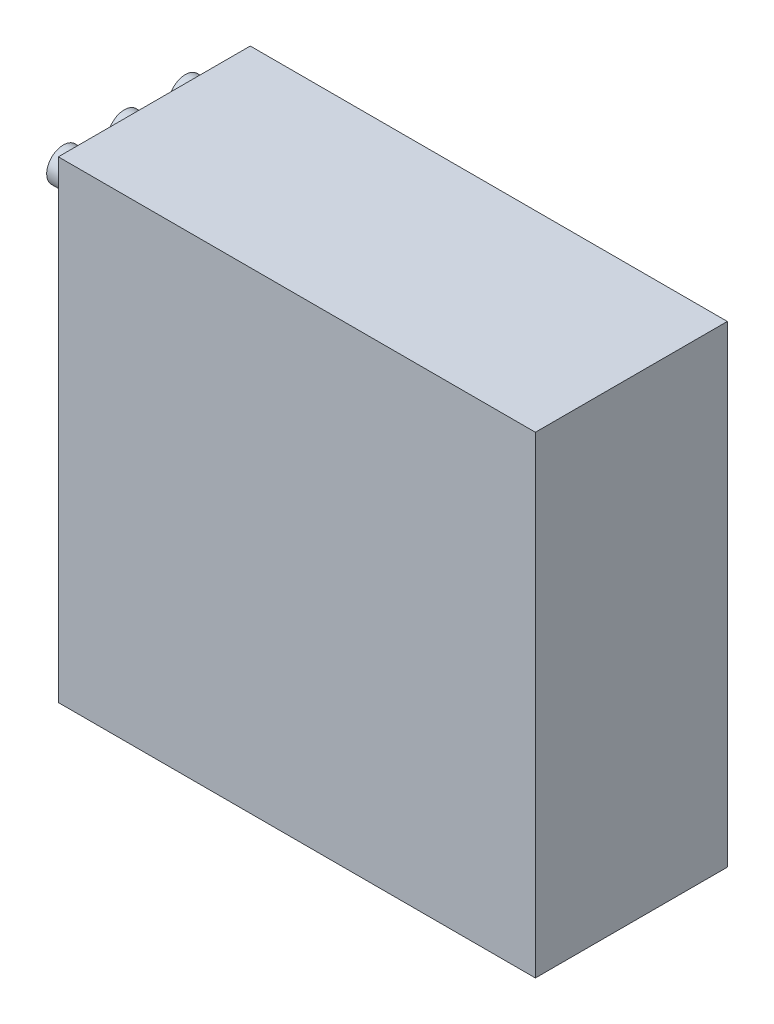
ISO-10303-21;
HEADER;
FILE_DESCRIPTION(('STEP AP214'),'2;1');
FILE_NAME('part.step','',(''),(''),'','','');
FILE_SCHEMA(('AUTOMOTIVE_DESIGN { 1 0 10303 214 1 1 1 1 }'));
ENDSEC;
DATA;
#1=APPLICATION_CONTEXT('core data for automotive mechanical design processes');
#2=APPLICATION_PROTOCOL_DEFINITION('international standard','automotive_design',2000,#1);
#3=PRODUCT_CONTEXT('',#1,'mechanical');
#4=PRODUCT('Part','Part','',(#3));
#5=PRODUCT_RELATED_PRODUCT_CATEGORY('part','',(#4));
#6=PRODUCT_DEFINITION_FORMATION('','',#4);
#7=PRODUCT_DEFINITION_CONTEXT('part definition',#1,'design');
#8=PRODUCT_DEFINITION('design','',#6,#7);
#9=PRODUCT_DEFINITION_SHAPE('','',#8);
#10=(LENGTH_UNIT() NAMED_UNIT(*) SI_UNIT(.MILLI.,.METRE.));
#11=(NAMED_UNIT(*) PLANE_ANGLE_UNIT() SI_UNIT($,.RADIAN.));
#12=(NAMED_UNIT(*) SI_UNIT($,.STERADIAN.) SOLID_ANGLE_UNIT());
#13=UNCERTAINTY_MEASURE_WITH_UNIT(LENGTH_MEASURE(1.E-05),#10,'distance_accuracy_value','');
#14=(GEOMETRIC_REPRESENTATION_CONTEXT(3) GLOBAL_UNCERTAINTY_ASSIGNED_CONTEXT((#13)) GLOBAL_UNIT_ASSIGNED_CONTEXT((#10,
#11,#12)) REPRESENTATION_CONTEXT('',''));
#15=CARTESIAN_POINT('',(0.,0.,0.));
#16=DIRECTION('',(0.,0.,1.));
#17=DIRECTION('',(1.,0.,0.));
#18=AXIS2_PLACEMENT_3D('',#15,#16,#17);
#19=CARTESIAN_POINT('',(0.,426.,173.));
#20=DIRECTION('',(1.,0.,0.));
#21=DIRECTION('',(0.,0.,-1.));
#22=AXIS2_PLACEMENT_3D('',#19,#20,#21);
#23=PLANE('',#22);
#24=CARTESIAN_POINT('',(0.,391.,141.5));
#25=DIRECTION('',(1.,0.,0.));
#26=DIRECTION('',(0.,0.,-1.));
#27=AXIS2_PLACEMENT_3D('',#24,#25,#26);
#28=CIRCLE('',#27,15.);
#29=CARTESIAN_POINT('',(0.,391.,126.5));
#30=VERTEX_POINT('',#29);
#31=EDGE_CURVE('E11',#30,#30,#28,.F.);
#32=ORIENTED_EDGE('',*,*,#31,.F.);
#33=EDGE_LOOP('',(#32));
#34=FACE_BOUND('',#33,.T.);
#35=CARTESIAN_POINT('',(0.,391.,86.5));
#36=DIRECTION('',(1.,0.,0.));
#37=DIRECTION('',(0.,0.,-1.));
#38=AXIS2_PLACEMENT_3D('',#35,#36,#37);
#39=CIRCLE('',#38,15.);
#40=CARTESIAN_POINT('',(0.,391.,71.5));
#41=VERTEX_POINT('',#40);
#42=EDGE_CURVE('E50',#41,#41,#39,.F.);
#43=ORIENTED_EDGE('',*,*,#42,.F.);
#44=EDGE_LOOP('',(#43));
#45=FACE_BOUND('',#44,.T.);
#46=CARTESIAN_POINT('',(0.,391.,31.5));
#47=DIRECTION('',(1.,0.,0.));
#48=DIRECTION('',(0.,0.,-1.));
#49=AXIS2_PLACEMENT_3D('',#46,#47,#48);
#50=CIRCLE('',#49,15.);
#51=CARTESIAN_POINT('',(0.,391.,16.5));
#52=VERTEX_POINT('',#51);
#53=EDGE_CURVE('E130',#52,#52,#50,.F.);
#54=ORIENTED_EDGE('',*,*,#53,.F.);
#55=EDGE_LOOP('',(#54));
#56=FACE_BOUND('',#55,.T.);
#57=DIRECTION('',(0.,-1.,0.));
#58=VECTOR('',#57,1.);
#59=CARTESIAN_POINT('',(0.,426.,0.));
#60=LINE('',#59,#58);
#61=CARTESIAN_POINT('',(0.,426.,0.));
#62=VERTEX_POINT('',#61);
#63=CARTESIAN_POINT('',(0.,0.,0.));
#64=VERTEX_POINT('',#63);
#65=EDGE_CURVE('E113',#62,#64,#60,.T.);
#66=ORIENTED_EDGE('',*,*,#65,.T.);
#67=DIRECTION('',(0.,0.,-1.));
#68=VECTOR('',#67,1.);
#69=CARTESIAN_POINT('',(0.,0.,173.));
#70=LINE('',#69,#68);
#71=CARTESIAN_POINT('',(0.,0.,173.));
#72=VERTEX_POINT('',#71);
#73=EDGE_CURVE('E102',#72,#64,#70,.T.);
#74=ORIENTED_EDGE('',*,*,#73,.F.);
#75=DIRECTION('',(0.,-1.,0.));
#76=VECTOR('',#75,1.);
#77=CARTESIAN_POINT('',(0.,426.,173.));
#78=LINE('',#77,#76);
#79=CARTESIAN_POINT('',(0.,426.,173.));
#80=VERTEX_POINT('',#79);
#81=EDGE_CURVE('E94',#80,#72,#78,.T.);
#82=ORIENTED_EDGE('',*,*,#81,.F.);
#83=DIRECTION('',(0.,0.,-1.));
#84=VECTOR('',#83,1.);
#85=CARTESIAN_POINT('',(0.,426.,173.));
#86=LINE('',#85,#84);
#87=EDGE_CURVE('E109',#80,#62,#86,.T.);
#88=ORIENTED_EDGE('',*,*,#87,.T.);
#89=EDGE_LOOP('',(#66,#74,#82,#88));
#90=FACE_BOUND('',#89,.T.);
#91=ADVANCED_FACE('F41',(#34,#45,#56,#90),#23,.F.);
#92=CARTESIAN_POINT('',(0.,0.,173.));
#93=DIRECTION('',(0.,1.,0.));
#94=DIRECTION('',(0.,0.,1.));
#95=AXIS2_PLACEMENT_3D('',#92,#93,#94);
#96=PLANE('',#95);
#97=DIRECTION('',(1.,0.,0.));
#98=VECTOR('',#97,1.);
#99=CARTESIAN_POINT('',(0.,0.,0.));
#100=LINE('',#99,#98);
#101=CARTESIAN_POINT('',(430.,0.,0.));
#102=VERTEX_POINT('',#101);
#103=EDGE_CURVE('E100',#64,#102,#100,.T.);
#104=ORIENTED_EDGE('',*,*,#103,.T.);
#105=DIRECTION('',(0.,0.,-1.));
#106=VECTOR('',#105,1.);
#107=CARTESIAN_POINT('',(430.,0.,173.));
#108=LINE('',#107,#106);
#109=CARTESIAN_POINT('',(430.,0.,173.));
#110=VERTEX_POINT('',#109);
#111=EDGE_CURVE('E98',#110,#102,#108,.T.);
#112=ORIENTED_EDGE('',*,*,#111,.F.);
#113=DIRECTION('',(1.,0.,0.));
#114=VECTOR('',#113,1.);
#115=CARTESIAN_POINT('',(0.,0.,173.));
#116=LINE('',#115,#114);
#117=EDGE_CURVE('E89',#72,#110,#116,.T.);
#118=ORIENTED_EDGE('',*,*,#117,.F.);
#119=ORIENTED_EDGE('',*,*,#73,.T.);
#120=EDGE_LOOP('',(#104,#112,#118,#119));
#121=FACE_BOUND('',#120,.T.);
#122=ADVANCED_FACE('F99',(#121),#96,.F.);
#123=CARTESIAN_POINT('',(430.,0.,173.));
#124=DIRECTION('',(-1.,0.,0.));
#125=DIRECTION('',(0.,0.,1.));
#126=AXIS2_PLACEMENT_3D('',#123,#124,#125);
#127=PLANE('',#126);
#128=DIRECTION('',(0.,1.,0.));
#129=VECTOR('',#128,1.);
#130=CARTESIAN_POINT('',(430.,0.,0.));
#131=LINE('',#130,#129);
#132=CARTESIAN_POINT('',(430.,426.,0.));
#133=VERTEX_POINT('',#132);
#134=EDGE_CURVE('E75',#102,#133,#131,.T.);
#135=ORIENTED_EDGE('',*,*,#134,.T.);
#136=DIRECTION('',(0.,0.,-1.));
#137=VECTOR('',#136,1.);
#138=CARTESIAN_POINT('',(430.,426.,173.));
#139=LINE('',#138,#137);
#140=CARTESIAN_POINT('',(430.,426.,173.));
#141=VERTEX_POINT('',#140);
#142=EDGE_CURVE('E103',#141,#133,#139,.T.);
#143=ORIENTED_EDGE('',*,*,#142,.F.);
#144=DIRECTION('',(0.,1.,0.));
#145=VECTOR('',#144,1.);
#146=CARTESIAN_POINT('',(430.,0.,173.));
#147=LINE('',#146,#145);
#148=EDGE_CURVE('E92',#110,#141,#147,.T.);
#149=ORIENTED_EDGE('',*,*,#148,.F.);
#150=ORIENTED_EDGE('',*,*,#111,.T.);
#151=EDGE_LOOP('',(#135,#143,#149,#150));
#152=FACE_BOUND('',#151,.T.);
#153=ADVANCED_FACE('F105',(#152),#127,.F.);
#154=CARTESIAN_POINT('',(430.,426.,173.));
#155=DIRECTION('',(0.,-1.,0.));
#156=DIRECTION('',(0.,0.,-1.));
#157=AXIS2_PLACEMENT_3D('',#154,#155,#156);
#158=PLANE('',#157);
#159=DIRECTION('',(-1.,0.,0.));
#160=VECTOR('',#159,1.);
#161=CARTESIAN_POINT('',(430.,426.,0.));
#162=LINE('',#161,#160);
#163=EDGE_CURVE('E81',#133,#62,#162,.T.);
#164=ORIENTED_EDGE('',*,*,#163,.T.);
#165=ORIENTED_EDGE('',*,*,#87,.F.);
#166=DIRECTION('',(-1.,0.,0.));
#167=VECTOR('',#166,1.);
#168=CARTESIAN_POINT('',(430.,426.,173.));
#169=LINE('',#168,#167);
#170=EDGE_CURVE('E58',#141,#80,#169,.T.);
#171=ORIENTED_EDGE('',*,*,#170,.F.);
#172=ORIENTED_EDGE('',*,*,#142,.T.);
#173=EDGE_LOOP('',(#164,#165,#171,#172));
#174=FACE_BOUND('',#173,.T.);
#175=ADVANCED_FACE('F157',(#174),#158,.F.);
#176=CARTESIAN_POINT('',(0.,0.,173.));
#177=DIRECTION('',(0.,0.,1.));
#178=DIRECTION('',(1.,0.,0.));
#179=AXIS2_PLACEMENT_3D('',#176,#177,#178);
#180=PLANE('',#179);
#181=ORIENTED_EDGE('',*,*,#81,.T.);
#182=ORIENTED_EDGE('',*,*,#117,.T.);
#183=ORIENTED_EDGE('',*,*,#148,.T.);
#184=ORIENTED_EDGE('',*,*,#170,.T.);
#185=EDGE_LOOP('',(#181,#182,#183,#184));
#186=FACE_BOUND('',#185,.T.);
#187=ADVANCED_FACE('F90',(#186),#180,.T.);
#188=CARTESIAN_POINT('',(0.,0.,0.));
#189=DIRECTION('',(0.,0.,1.));
#190=DIRECTION('',(1.,0.,0.));
#191=AXIS2_PLACEMENT_3D('',#188,#189,#190);
#192=PLANE('',#191);
#193=ORIENTED_EDGE('',*,*,#65,.F.);
#194=ORIENTED_EDGE('',*,*,#163,.F.);
#195=ORIENTED_EDGE('',*,*,#134,.F.);
#196=ORIENTED_EDGE('',*,*,#103,.F.);
#197=EDGE_LOOP('',(#193,#194,#195,#196));
#198=FACE_BOUND('',#197,.T.);
#199=ADVANCED_FACE('F146',(#198),#192,.F.);
#200=CARTESIAN_POINT('',(-27.,391.,31.5));
#201=DIRECTION('',(1.,0.,0.));
#202=DIRECTION('',(0.,0.,-1.));
#203=AXIS2_PLACEMENT_3D('',#200,#201,#202);
#204=CYLINDRICAL_SURFACE('',#203,15.);
#205=CARTESIAN_POINT('',(-27.,391.,31.5));
#206=DIRECTION('',(-1.,0.,0.));
#207=DIRECTION('',(0.,0.,1.));
#208=AXIS2_PLACEMENT_3D('',#205,#206,#207);
#209=CIRCLE('',#208,15.);
#210=CARTESIAN_POINT('',(-27.,391.,46.5));
#211=VERTEX_POINT('',#210);
#212=EDGE_CURVE('E117',#211,#211,#209,.T.);
#213=ORIENTED_EDGE('',*,*,#212,.F.);
#214=EDGE_LOOP('',(#213));
#215=FACE_BOUND('',#214,.T.);
#216=ORIENTED_EDGE('',*,*,#53,.T.);
#217=EDGE_LOOP('',(#216));
#218=FACE_BOUND('',#217,.T.);
#219=ADVANCED_FACE('F148',(#215,#218),#204,.T.);
#220=CARTESIAN_POINT('',(-27.,0.,0.));
#221=DIRECTION('',(-1.,0.,0.));
#222=DIRECTION('',(0.,0.,1.));
#223=AXIS2_PLACEMENT_3D('',#220,#221,#222);
#224=PLANE('',#223);
#225=ORIENTED_EDGE('',*,*,#212,.T.);
#226=EDGE_LOOP('',(#225));
#227=FACE_BOUND('',#226,.T.);
#228=ADVANCED_FACE('F154',(#227),#224,.T.);
#229=CARTESIAN_POINT('',(-27.,391.,86.5));
#230=DIRECTION('',(1.,0.,0.));
#231=DIRECTION('',(0.,0.,-1.));
#232=AXIS2_PLACEMENT_3D('',#229,#230,#231);
#233=CYLINDRICAL_SURFACE('',#232,15.);
#234=CARTESIAN_POINT('',(-27.,391.,86.5));
#235=DIRECTION('',(-1.,0.,0.));
#236=DIRECTION('',(0.,0.,1.));
#237=AXIS2_PLACEMENT_3D('',#234,#235,#236);
#238=CIRCLE('',#237,15.);
#239=CARTESIAN_POINT('',(-27.,391.,101.5));
#240=VERTEX_POINT('',#239);
#241=EDGE_CURVE('E252',#240,#240,#238,.T.);
#242=ORIENTED_EDGE('',*,*,#241,.F.);
#243=EDGE_LOOP('',(#242));
#244=FACE_BOUND('',#243,.T.);
#245=ORIENTED_EDGE('',*,*,#42,.T.);
#246=EDGE_LOOP('',(#245));
#247=FACE_BOUND('',#246,.T.);
#248=ADVANCED_FACE('F137',(#244,#247),#233,.T.);
#249=CARTESIAN_POINT('',(-27.,0.,0.));
#250=DIRECTION('',(-1.,0.,0.));
#251=DIRECTION('',(0.,0.,1.));
#252=AXIS2_PLACEMENT_3D('',#249,#250,#251);
#253=PLANE('',#252);
#254=ORIENTED_EDGE('',*,*,#241,.T.);
#255=EDGE_LOOP('',(#254));
#256=FACE_BOUND('',#255,.T.);
#257=ADVANCED_FACE('F212',(#256),#253,.T.);
#258=CARTESIAN_POINT('',(-27.,391.,141.5));
#259=DIRECTION('',(1.,0.,0.));
#260=DIRECTION('',(0.,0.,-1.));
#261=AXIS2_PLACEMENT_3D('',#258,#259,#260);
#262=CYLINDRICAL_SURFACE('',#261,15.);
#263=CARTESIAN_POINT('',(-27.,391.,141.5));
#264=DIRECTION('',(-1.,0.,0.));
#265=DIRECTION('',(0.,0.,1.));
#266=AXIS2_PLACEMENT_3D('',#263,#264,#265);
#267=CIRCLE('',#266,15.);
#268=CARTESIAN_POINT('',(-27.,391.,156.5));
#269=VERTEX_POINT('',#268);
#270=EDGE_CURVE('E250',#269,#269,#267,.T.);
#271=ORIENTED_EDGE('',*,*,#270,.F.);
#272=EDGE_LOOP('',(#271));
#273=FACE_BOUND('',#272,.T.);
#274=ORIENTED_EDGE('',*,*,#31,.T.);
#275=EDGE_LOOP('',(#274));
#276=FACE_BOUND('',#275,.T.);
#277=ADVANCED_FACE('F223',(#273,#276),#262,.T.);
#278=CARTESIAN_POINT('',(-27.,0.,0.));
#279=DIRECTION('',(-1.,0.,0.));
#280=DIRECTION('',(0.,0.,1.));
#281=AXIS2_PLACEMENT_3D('',#278,#279,#280);
#282=PLANE('',#281);
#283=ORIENTED_EDGE('',*,*,#270,.T.);
#284=EDGE_LOOP('',(#283));
#285=FACE_BOUND('',#284,.T.);
#286=ADVANCED_FACE('F234',(#285),#282,.T.);
#287=CLOSED_SHELL('',(#91,#122,#153,#175,#187,#199,#219,#228,#248,#257,#277,#286));
#288=MANIFOLD_SOLID_BREP('B2',#287);
#289=ADVANCED_BREP_SHAPE_REPRESENTATION('',(#18,#288),#14);
#290=SHAPE_DEFINITION_REPRESENTATION(#9,#289);
ENDSEC;
END-ISO-10303-21;
